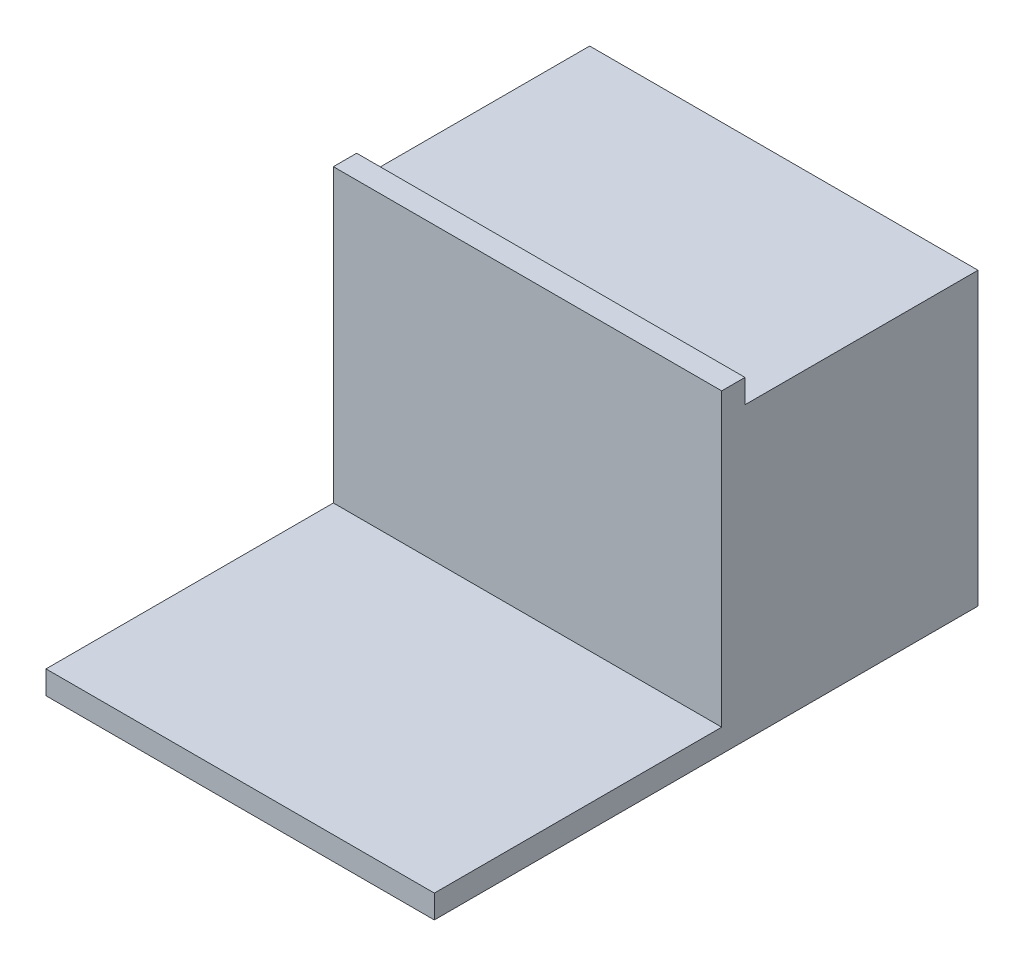
ISO-10303-21;
HEADER;
FILE_DESCRIPTION(('STEP AP214'),'2;1');
FILE_NAME('part.step','',(''),(''),'','','');
FILE_SCHEMA(('AUTOMOTIVE_DESIGN { 1 0 10303 214 1 1 1 1 }'));
ENDSEC;
DATA;
#1=APPLICATION_CONTEXT('core data for automotive mechanical design processes');
#2=APPLICATION_PROTOCOL_DEFINITION('international standard','automotive_design',2000,#1);
#3=PRODUCT_CONTEXT('',#1,'mechanical');
#4=PRODUCT('Part','Part','',(#3));
#5=PRODUCT_RELATED_PRODUCT_CATEGORY('part','',(#4));
#6=PRODUCT_DEFINITION_FORMATION('','',#4);
#7=PRODUCT_DEFINITION_CONTEXT('part definition',#1,'design');
#8=PRODUCT_DEFINITION('design','',#6,#7);
#9=PRODUCT_DEFINITION_SHAPE('','',#8);
#10=(LENGTH_UNIT() NAMED_UNIT(*) SI_UNIT(.MILLI.,.METRE.));
#11=(NAMED_UNIT(*) PLANE_ANGLE_UNIT() SI_UNIT($,.RADIAN.));
#12=(NAMED_UNIT(*) SI_UNIT($,.STERADIAN.) SOLID_ANGLE_UNIT());
#13=UNCERTAINTY_MEASURE_WITH_UNIT(LENGTH_MEASURE(1.E-05),#10,'distance_accuracy_value','');
#14=(GEOMETRIC_REPRESENTATION_CONTEXT(3) GLOBAL_UNCERTAINTY_ASSIGNED_CONTEXT((#13)) GLOBAL_UNIT_ASSIGNED_CONTEXT((#10,
#11,#12)) REPRESENTATION_CONTEXT('',''));
#15=CARTESIAN_POINT('',(0.,0.,0.));
#16=DIRECTION('',(0.,0.,1.));
#17=DIRECTION('',(1.,0.,0.));
#18=AXIS2_PLACEMENT_3D('',#15,#16,#17);
#19=CARTESIAN_POINT('',(0.,0.,0.));
#20=DIRECTION('',(0.,0.,1.));
#21=DIRECTION('',(1.,0.,0.));
#22=AXIS2_PLACEMENT_3D('',#19,#20,#21);
#23=PLANE('',#22);
#24=DIRECTION('',(1.,0.,0.));
#25=VECTOR('',#24,1.);
#26=CARTESIAN_POINT('',(0.,3445.2,0.));
#27=LINE('',#26,#25);
#28=CARTESIAN_POINT('',(-5000.,3445.2,0.));
#29=VERTEX_POINT('',#28);
#30=CARTESIAN_POINT('',(0.,3445.2,0.));
#31=VERTEX_POINT('',#30);
#32=EDGE_CURVE('E67',#29,#31,#27,.T.);
#33=ORIENTED_EDGE('',*,*,#32,.F.);
#34=DIRECTION('',(0.,1.,0.));
#35=VECTOR('',#34,1.);
#36=CARTESIAN_POINT('',(-5000.,0.,0.));
#37=LINE('',#36,#35);
#38=CARTESIAN_POINT('',(-5000.,3750.,0.));
#39=VERTEX_POINT('',#38);
#40=EDGE_CURVE('E199',#29,#39,#37,.T.);
#41=ORIENTED_EDGE('',*,*,#40,.T.);
#42=DIRECTION('',(1.,0.,0.));
#43=VECTOR('',#42,1.);
#44=CARTESIAN_POINT('',(0.,3750.,0.));
#45=LINE('',#44,#43);
#46=CARTESIAN_POINT('',(0.,3750.,0.));
#47=VERTEX_POINT('',#46);
#48=EDGE_CURVE('E187',#39,#47,#45,.T.);
#49=ORIENTED_EDGE('',*,*,#48,.T.);
#50=DIRECTION('',(0.,-1.,0.));
#51=VECTOR('',#50,1.);
#52=CARTESIAN_POINT('',(0.,0.,0.));
#53=LINE('',#52,#51);
#54=EDGE_CURVE('E183',#47,#31,#53,.T.);
#55=ORIENTED_EDGE('',*,*,#54,.T.);
#56=EDGE_LOOP('',(#33,#41,#49,#55));
#57=FACE_BOUND('',#56,.T.);
#58=ADVANCED_FACE('F51',(#57),#23,.F.);
#59=CARTESIAN_POINT('',(0.,0.,300.));
#60=DIRECTION('',(1.,0.,0.));
#61=DIRECTION('',(0.,0.,-1.));
#62=AXIS2_PLACEMENT_3D('',#59,#60,#61);
#63=PLANE('',#62);
#64=ORIENTED_EDGE('',*,*,#54,.F.);
#65=DIRECTION('',(0.,0.,-1.));
#66=VECTOR('',#65,1.);
#67=CARTESIAN_POINT('',(0.,3750.,300.));
#68=LINE('',#67,#66);
#69=CARTESIAN_POINT('',(0.,3750.,300.));
#70=VERTEX_POINT('',#69);
#71=EDGE_CURVE('E11',#70,#47,#68,.T.);
#72=ORIENTED_EDGE('',*,*,#71,.F.);
#73=DIRECTION('',(0.,-1.,0.));
#74=VECTOR('',#73,1.);
#75=CARTESIAN_POINT('',(0.,0.,300.));
#76=LINE('',#75,#74);
#77=CARTESIAN_POINT('',(0.,0.,300.));
#78=VERTEX_POINT('',#77);
#79=EDGE_CURVE('E184',#70,#78,#76,.T.);
#80=ORIENTED_EDGE('',*,*,#79,.T.);
#81=DIRECTION('',(0.,0.,1.));
#82=VECTOR('',#81,1.);
#83=CARTESIAN_POINT('',(0.,0.,0.));
#84=LINE('',#83,#82);
#85=CARTESIAN_POINT('',(0.,0.,4000.));
#86=VERTEX_POINT('',#85);
#87=EDGE_CURVE('E163',#78,#86,#84,.T.);
#88=ORIENTED_EDGE('',*,*,#87,.T.);
#89=DIRECTION('',(0.,1.,0.));
#90=VECTOR('',#89,1.);
#91=CARTESIAN_POINT('',(0.,-300.,4000.));
#92=LINE('',#91,#90);
#93=CARTESIAN_POINT('',(0.,-300.,4000.));
#94=VERTEX_POINT('',#93);
#95=EDGE_CURVE('E128',#94,#86,#92,.T.);
#96=ORIENTED_EDGE('',*,*,#95,.F.);
#97=DIRECTION('',(0.,0.,1.));
#98=VECTOR('',#97,1.);
#99=CARTESIAN_POINT('',(0.,-300.,0.));
#100=LINE('',#99,#98);
#101=CARTESIAN_POINT('',(0.,-300.,-3000.));
#102=VERTEX_POINT('',#101);
#103=EDGE_CURVE('E122',#102,#94,#100,.T.);
#104=ORIENTED_EDGE('',*,*,#103,.F.);
#105=DIRECTION('',(0.,-1.,0.));
#106=VECTOR('',#105,1.);
#107=CARTESIAN_POINT('',(0.,3445.2,-3000.));
#108=LINE('',#107,#106);
#109=CARTESIAN_POINT('',(0.,3445.2,-3000.));
#110=VERTEX_POINT('',#109);
#111=EDGE_CURVE('E126',#110,#102,#108,.T.);
#112=ORIENTED_EDGE('',*,*,#111,.F.);
#113=DIRECTION('',(0.,0.,1.));
#114=VECTOR('',#113,1.);
#115=CARTESIAN_POINT('',(0.,3445.2,-3000.));
#116=LINE('',#115,#114);
#117=EDGE_CURVE('E156',#110,#31,#116,.T.);
#118=ORIENTED_EDGE('',*,*,#117,.T.);
#119=EDGE_LOOP('',(#64,#72,#80,#88,#96,#104,#112,#118));
#120=FACE_BOUND('',#119,.T.);
#121=ADVANCED_FACE('F53',(#120),#63,.T.);
#122=CARTESIAN_POINT('',(0.,3750.,300.));
#123=DIRECTION('',(0.,1.,0.));
#124=DIRECTION('',(0.,0.,1.));
#125=AXIS2_PLACEMENT_3D('',#122,#123,#124);
#126=PLANE('',#125);
#127=ORIENTED_EDGE('',*,*,#48,.F.);
#128=DIRECTION('',(0.,0.,-1.));
#129=VECTOR('',#128,1.);
#130=CARTESIAN_POINT('',(-5000.,3750.,300.));
#131=LINE('',#130,#129);
#132=CARTESIAN_POINT('',(-5000.,3750.,300.));
#133=VERTEX_POINT('',#132);
#134=EDGE_CURVE('E55',#133,#39,#131,.T.);
#135=ORIENTED_EDGE('',*,*,#134,.F.);
#136=DIRECTION('',(1.,0.,0.));
#137=VECTOR('',#136,1.);
#138=CARTESIAN_POINT('',(0.,3750.,300.));
#139=LINE('',#138,#137);
#140=EDGE_CURVE('E194',#133,#70,#139,.T.);
#141=ORIENTED_EDGE('',*,*,#140,.T.);
#142=ORIENTED_EDGE('',*,*,#71,.T.);
#143=EDGE_LOOP('',(#127,#135,#141,#142));
#144=FACE_BOUND('',#143,.T.);
#145=ADVANCED_FACE('F205',(#144),#126,.T.);
#146=CARTESIAN_POINT('',(-5000.,0.,300.));
#147=DIRECTION('',(-1.,0.,0.));
#148=DIRECTION('',(0.,0.,1.));
#149=AXIS2_PLACEMENT_3D('',#146,#147,#148);
#150=PLANE('',#149);
#151=ORIENTED_EDGE('',*,*,#40,.F.);
#152=DIRECTION('',(0.,0.,1.));
#153=VECTOR('',#152,1.);
#154=CARTESIAN_POINT('',(-5000.,3445.2,-3000.));
#155=LINE('',#154,#153);
#156=CARTESIAN_POINT('',(-5000.,3445.2,-3000.));
#157=VERTEX_POINT('',#156);
#158=EDGE_CURVE('E160',#157,#29,#155,.T.);
#159=ORIENTED_EDGE('',*,*,#158,.F.);
#160=DIRECTION('',(0.,1.,0.));
#161=VECTOR('',#160,1.);
#162=CARTESIAN_POINT('',(-5000.,3445.2,-3000.));
#163=LINE('',#162,#161);
#164=CARTESIAN_POINT('',(-5000.,-300.,-3000.));
#165=VERTEX_POINT('',#164);
#166=EDGE_CURVE('E142',#165,#157,#163,.T.);
#167=ORIENTED_EDGE('',*,*,#166,.F.);
#168=DIRECTION('',(0.,0.,-1.));
#169=VECTOR('',#168,1.);
#170=CARTESIAN_POINT('',(-5000.,-300.,-6.12323399573677E-13));
#171=LINE('',#170,#169);
#172=CARTESIAN_POINT('',(-5000.,-300.,4000.));
#173=VERTEX_POINT('',#172);
#174=EDGE_CURVE('E138',#173,#165,#171,.T.);
#175=ORIENTED_EDGE('',*,*,#174,.F.);
#176=DIRECTION('',(0.,1.,0.));
#177=VECTOR('',#176,1.);
#178=CARTESIAN_POINT('',(-5000.,-300.,4000.));
#179=LINE('',#178,#177);
#180=CARTESIAN_POINT('',(-5000.,0.,4000.));
#181=VERTEX_POINT('',#180);
#182=EDGE_CURVE('E169',#173,#181,#179,.T.);
#183=ORIENTED_EDGE('',*,*,#182,.T.);
#184=DIRECTION('',(0.,0.,-1.));
#185=VECTOR('',#184,1.);
#186=CARTESIAN_POINT('',(-5000.,0.,-6.12323399573677E-13));
#187=LINE('',#186,#185);
#188=CARTESIAN_POINT('',(-5000.,0.,300.));
#189=VERTEX_POINT('',#188);
#190=EDGE_CURVE('E132',#181,#189,#187,.T.);
#191=ORIENTED_EDGE('',*,*,#190,.T.);
#192=DIRECTION('',(0.,1.,0.));
#193=VECTOR('',#192,1.);
#194=CARTESIAN_POINT('',(-5000.,0.,300.));
#195=LINE('',#194,#193);
#196=EDGE_CURVE('E190',#189,#133,#195,.T.);
#197=ORIENTED_EDGE('',*,*,#196,.T.);
#198=ORIENTED_EDGE('',*,*,#134,.T.);
#199=EDGE_LOOP('',(#151,#159,#167,#175,#183,#191,#197,#198));
#200=FACE_BOUND('',#199,.T.);
#201=ADVANCED_FACE('F209',(#200),#150,.T.);
#202=CARTESIAN_POINT('',(0.,0.,300.));
#203=DIRECTION('',(0.,0.,1.));
#204=DIRECTION('',(1.,0.,0.));
#205=AXIS2_PLACEMENT_3D('',#202,#203,#204);
#206=PLANE('',#205);
#207=ORIENTED_EDGE('',*,*,#79,.F.);
#208=ORIENTED_EDGE('',*,*,#140,.F.);
#209=ORIENTED_EDGE('',*,*,#196,.F.);
#210=DIRECTION('',(-1.,0.,0.));
#211=VECTOR('',#210,1.);
#212=CARTESIAN_POINT('',(0.,0.,300.));
#213=LINE('',#212,#211);
#214=EDGE_CURVE('E91',#78,#189,#213,.T.);
#215=ORIENTED_EDGE('',*,*,#214,.F.);
#216=EDGE_LOOP('',(#207,#208,#209,#215));
#217=FACE_BOUND('',#216,.T.);
#218=ADVANCED_FACE('F211',(#217),#206,.T.);
#219=CARTESIAN_POINT('',(0.,0.,0.));
#220=DIRECTION('',(0.,-1.,0.));
#221=DIRECTION('',(0.,0.,-1.));
#222=AXIS2_PLACEMENT_3D('',#219,#220,#221);
#223=PLANE('',#222);
#224=ORIENTED_EDGE('',*,*,#87,.F.);
#225=ORIENTED_EDGE('',*,*,#214,.T.);
#226=ORIENTED_EDGE('',*,*,#190,.F.);
#227=DIRECTION('',(-1.,0.,0.));
#228=VECTOR('',#227,1.);
#229=CARTESIAN_POINT('',(0.,0.,4000.));
#230=LINE('',#229,#228);
#231=EDGE_CURVE('E172',#86,#181,#230,.T.);
#232=ORIENTED_EDGE('',*,*,#231,.F.);
#233=EDGE_LOOP('',(#224,#225,#226,#232));
#234=FACE_BOUND('',#233,.T.);
#235=ADVANCED_FACE('F215',(#234),#223,.F.);
#236=CARTESIAN_POINT('',(0.,-300.,4000.));
#237=DIRECTION('',(0.,0.,-1.));
#238=DIRECTION('',(-1.,0.,0.));
#239=AXIS2_PLACEMENT_3D('',#236,#237,#238);
#240=PLANE('',#239);
#241=ORIENTED_EDGE('',*,*,#231,.T.);
#242=ORIENTED_EDGE('',*,*,#182,.F.);
#243=DIRECTION('',(-1.,0.,0.));
#244=VECTOR('',#243,1.);
#245=CARTESIAN_POINT('',(0.,-300.,4000.));
#246=LINE('',#245,#244);
#247=EDGE_CURVE('E131',#94,#173,#246,.T.);
#248=ORIENTED_EDGE('',*,*,#247,.F.);
#249=ORIENTED_EDGE('',*,*,#95,.T.);
#250=EDGE_LOOP('',(#241,#242,#248,#249));
#251=FACE_BOUND('',#250,.T.);
#252=ADVANCED_FACE('F218',(#251),#240,.F.);
#253=CARTESIAN_POINT('',(0.,-300.,0.));
#254=DIRECTION('',(0.,-1.,0.));
#255=DIRECTION('',(0.,0.,-1.));
#256=AXIS2_PLACEMENT_3D('',#253,#254,#255);
#257=PLANE('',#256);
#258=ORIENTED_EDGE('',*,*,#103,.T.);
#259=ORIENTED_EDGE('',*,*,#247,.T.);
#260=ORIENTED_EDGE('',*,*,#174,.T.);
#261=DIRECTION('',(-1.,0.,0.));
#262=VECTOR('',#261,1.);
#263=CARTESIAN_POINT('',(0.,-300.,-3000.));
#264=LINE('',#263,#262);
#265=EDGE_CURVE('E135',#102,#165,#264,.T.);
#266=ORIENTED_EDGE('',*,*,#265,.F.);
#267=EDGE_LOOP('',(#258,#259,#260,#266));
#268=FACE_BOUND('',#267,.T.);
#269=ADVANCED_FACE('F136',(#268),#257,.T.);
#270=CARTESIAN_POINT('',(0.,3445.2,-3000.));
#271=DIRECTION('',(0.,-1.,0.));
#272=DIRECTION('',(0.,0.,-1.));
#273=AXIS2_PLACEMENT_3D('',#270,#271,#272);
#274=PLANE('',#273);
#275=ORIENTED_EDGE('',*,*,#32,.T.);
#276=ORIENTED_EDGE('',*,*,#117,.F.);
#277=DIRECTION('',(1.,0.,0.));
#278=VECTOR('',#277,1.);
#279=CARTESIAN_POINT('',(0.,3445.2,-3000.));
#280=LINE('',#279,#278);
#281=EDGE_CURVE('E146',#157,#110,#280,.T.);
#282=ORIENTED_EDGE('',*,*,#281,.F.);
#283=ORIENTED_EDGE('',*,*,#158,.T.);
#284=EDGE_LOOP('',(#275,#276,#282,#283));
#285=FACE_BOUND('',#284,.T.);
#286=ADVANCED_FACE('F221',(#285),#274,.F.);
#287=CARTESIAN_POINT('',(0.,0.,-3000.));
#288=DIRECTION('',(0.,0.,-1.));
#289=DIRECTION('',(-1.,0.,0.));
#290=AXIS2_PLACEMENT_3D('',#287,#288,#289);
#291=PLANE('',#290);
#292=ORIENTED_EDGE('',*,*,#111,.T.);
#293=ORIENTED_EDGE('',*,*,#265,.T.);
#294=ORIENTED_EDGE('',*,*,#166,.T.);
#295=ORIENTED_EDGE('',*,*,#281,.T.);
#296=EDGE_LOOP('',(#292,#293,#294,#295));
#297=FACE_BOUND('',#296,.T.);
#298=ADVANCED_FACE('F144',(#297),#291,.T.);
#299=CLOSED_SHELL('',(#58,#121,#145,#201,#218,#235,#252,#269,#286,#298));
#300=MANIFOLD_SOLID_BREP('B2',#299);
#301=ADVANCED_BREP_SHAPE_REPRESENTATION('',(#18,#300),#14);
#302=SHAPE_DEFINITION_REPRESENTATION(#9,#301);
ENDSEC;
END-ISO-10303-21;
